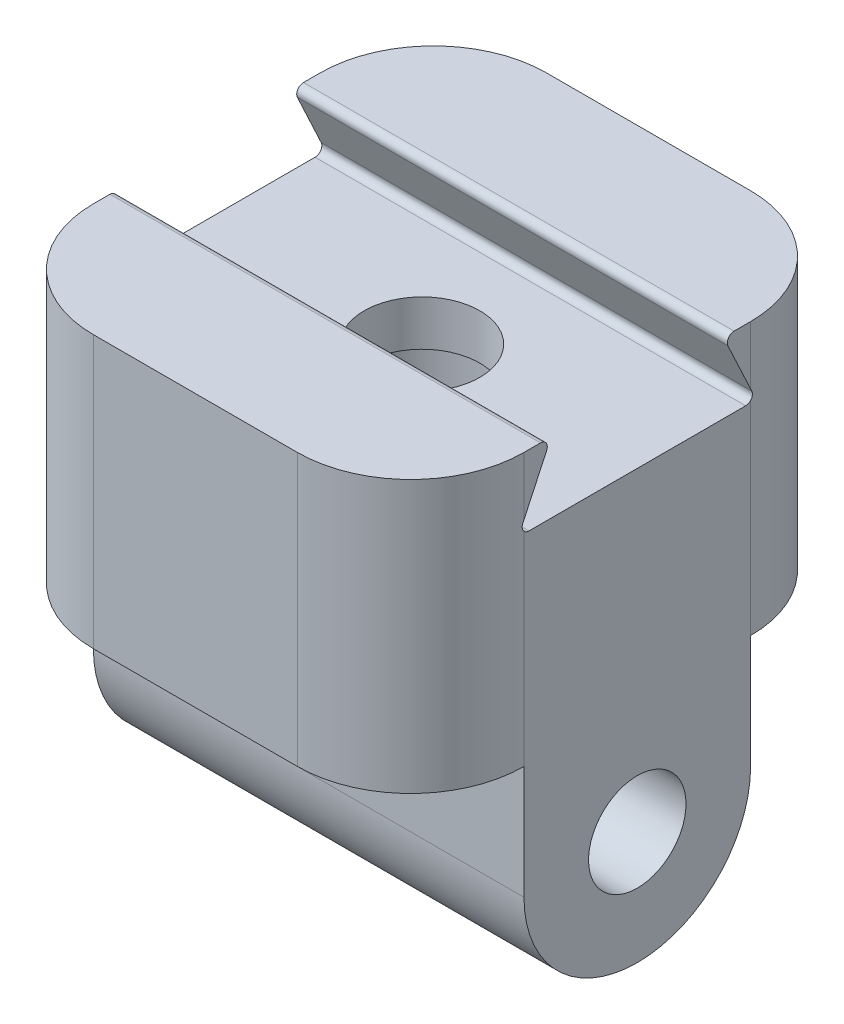
ISO-10303-21;
HEADER;
FILE_DESCRIPTION(('STEP AP214'),'2;1');
FILE_NAME('part.step','',(''),(''),'','','');
FILE_SCHEMA(('AUTOMOTIVE_DESIGN { 1 0 10303 214 1 1 1 1 }'));
ENDSEC;
DATA;
#1=APPLICATION_CONTEXT('core data for automotive mechanical design processes');
#2=APPLICATION_PROTOCOL_DEFINITION('international standard','automotive_design',2000,#1);
#3=PRODUCT_CONTEXT('',#1,'mechanical');
#4=PRODUCT('Part','Part','',(#3));
#5=PRODUCT_RELATED_PRODUCT_CATEGORY('part','',(#4));
#6=PRODUCT_DEFINITION_FORMATION('','',#4);
#7=PRODUCT_DEFINITION_CONTEXT('part definition',#1,'design');
#8=PRODUCT_DEFINITION('design','',#6,#7);
#9=PRODUCT_DEFINITION_SHAPE('','',#8);
#10=(LENGTH_UNIT() NAMED_UNIT(*) SI_UNIT(.MILLI.,.METRE.));
#11=(NAMED_UNIT(*) PLANE_ANGLE_UNIT() SI_UNIT($,.RADIAN.));
#12=(NAMED_UNIT(*) SI_UNIT($,.STERADIAN.) SOLID_ANGLE_UNIT());
#13=UNCERTAINTY_MEASURE_WITH_UNIT(LENGTH_MEASURE(1.E-05),#10,'distance_accuracy_value','');
#14=(GEOMETRIC_REPRESENTATION_CONTEXT(3) GLOBAL_UNCERTAINTY_ASSIGNED_CONTEXT((#13)) GLOBAL_UNIT_ASSIGNED_CONTEXT((#10,
#11,#12)) REPRESENTATION_CONTEXT('',''));
#15=CARTESIAN_POINT('',(0.,0.,0.));
#16=DIRECTION('',(0.,0.,1.));
#17=DIRECTION('',(1.,0.,0.));
#18=AXIS2_PLACEMENT_3D('',#15,#16,#17);
#19=CARTESIAN_POINT('',(0.,0.,0.));
#20=DIRECTION('',(0.,-1.,0.));
#21=DIRECTION('',(0.,0.,-1.));
#22=AXIS2_PLACEMENT_3D('',#19,#20,#21);
#23=PLANE('',#22);
#24=DIRECTION('',(-1.,0.,0.));
#25=VECTOR('',#24,1.);
#26=CARTESIAN_POINT('',(9.5,0.,5.));
#27=LINE('',#26,#25);
#28=CARTESIAN_POINT('',(9.5,0.,5.));
#29=VERTEX_POINT('',#28);
#30=CARTESIAN_POINT('',(-9.5,0.,5.));
#31=VERTEX_POINT('',#30);
#32=EDGE_CURVE('E225',#29,#31,#27,.T.);
#33=ORIENTED_EDGE('',*,*,#32,.F.);
#34=CARTESIAN_POINT('',(4.5,0.,5.));
#35=DIRECTION('',(0.,-1.,0.));
#36=DIRECTION('',(0.,0.,-1.));
#37=AXIS2_PLACEMENT_3D('',#34,#35,#36);
#38=CIRCLE('',#37,5.);
#39=CARTESIAN_POINT('',(4.5,0.,10.));
#40=VERTEX_POINT('',#39);
#41=EDGE_CURVE('E222',#29,#40,#38,.T.);
#42=ORIENTED_EDGE('',*,*,#41,.T.);
#43=DIRECTION('',(1.,0.,0.));
#44=VECTOR('',#43,1.);
#45=CARTESIAN_POINT('',(9.5,0.,10.));
#46=LINE('',#45,#44);
#47=CARTESIAN_POINT('',(-4.5,0.,10.));
#48=VERTEX_POINT('',#47);
#49=EDGE_CURVE('E261',#48,#40,#46,.T.);
#50=ORIENTED_EDGE('',*,*,#49,.F.);
#51=CARTESIAN_POINT('',(-4.5,0.,5.));
#52=DIRECTION('',(0.,-1.,0.));
#53=DIRECTION('',(0.,0.,-1.));
#54=AXIS2_PLACEMENT_3D('',#51,#52,#53);
#55=CIRCLE('',#54,5.);
#56=EDGE_CURVE('E292',#48,#31,#55,.T.);
#57=ORIENTED_EDGE('',*,*,#56,.T.);
#58=EDGE_LOOP('',(#33,#42,#50,#57));
#59=FACE_BOUND('',#58,.T.);
#60=ADVANCED_FACE('F36',(#59),#23,.T.);
#61=CARTESIAN_POINT('',(9.5,12.,-10.));
#62=DIRECTION('',(-1.,0.,0.));
#63=DIRECTION('',(0.,0.,1.));
#64=AXIS2_PLACEMENT_3D('',#61,#62,#63);
#65=PLANE('',#64);
#66=CARTESIAN_POINT('',(9.5,-5.,0.));
#67=DIRECTION('',(1.,0.,0.));
#68=DIRECTION('',(0.,0.,-1.));
#69=AXIS2_PLACEMENT_3D('',#66,#67,#68);
#70=CIRCLE('',#69,2.15);
#71=CARTESIAN_POINT('',(9.5,-5.,-2.15));
#72=VERTEX_POINT('',#71);
#73=EDGE_CURVE('E232',#72,#72,#70,.T.);
#74=ORIENTED_EDGE('',*,*,#73,.F.);
#75=EDGE_LOOP('',(#74));
#76=FACE_BOUND('',#75,.T.);
#77=CARTESIAN_POINT('',(9.5,-5.,0.));
#78=DIRECTION('',(-1.,0.,0.));
#79=DIRECTION('',(0.,0.,1.));
#80=AXIS2_PLACEMENT_3D('',#77,#78,#79);
#81=CIRCLE('',#80,5.);
#82=CARTESIAN_POINT('',(9.5,-5.,5.));
#83=VERTEX_POINT('',#82);
#84=CARTESIAN_POINT('',(9.5,-10.,0.));
#85=VERTEX_POINT('',#84);
#86=EDGE_CURVE('E530',#83,#85,#81,.F.);
#87=ORIENTED_EDGE('',*,*,#86,.T.);
#88=CARTESIAN_POINT('',(9.5,-5.,0.));
#89=DIRECTION('',(-1.,0.,0.));
#90=DIRECTION('',(0.,0.,1.));
#91=AXIS2_PLACEMENT_3D('',#88,#89,#90);
#92=CIRCLE('',#91,5.);
#93=CARTESIAN_POINT('',(9.5,-5.,-5.));
#94=VERTEX_POINT('',#93);
#95=EDGE_CURVE('E193',#85,#94,#92,.F.);
#96=ORIENTED_EDGE('',*,*,#95,.T.);
#97=DIRECTION('',(0.,1.,0.));
#98=VECTOR('',#97,1.);
#99=CARTESIAN_POINT('',(9.5,-10.,-5.));
#100=LINE('',#99,#98);
#101=CARTESIAN_POINT('',(9.5,0.,-5.));
#102=VERTEX_POINT('',#101);
#103=EDGE_CURVE('E187',#94,#102,#100,.T.);
#104=ORIENTED_EDGE('',*,*,#103,.T.);
#105=DIRECTION('',(0.,-1.,0.));
#106=VECTOR('',#105,1.);
#107=CARTESIAN_POINT('',(9.5,12.,-5.));
#108=LINE('',#107,#106);
#109=CARTESIAN_POINT('',(9.5,8.98748545009601,-5.));
#110=VERTEX_POINT('',#109);
#111=EDGE_CURVE('E190',#102,#110,#108,.F.);
#112=ORIENTED_EDGE('',*,*,#111,.T.);
#113=CARTESIAN_POINT('',(9.5,9.19046496526112,-4.77909432686476));
#114=DIRECTION('',(-1.,0.,0.));
#115=DIRECTION('',(0.,0.,1.));
#116=AXIS2_PLACEMENT_3D('',#113,#114,#115);
#117=CIRCLE('',#116,0.3);
#118=CARTESIAN_POINT('',(9.5,8.89046496526112,-4.77909432686476));
#119=VERTEX_POINT('',#118);
#120=EDGE_CURVE('E370',#110,#119,#117,.T.);
#121=ORIENTED_EDGE('',*,*,#120,.T.);
#122=DIRECTION('',(0.,0.,-1.));
#123=VECTOR('',#122,1.);
#124=CARTESIAN_POINT('',(9.5,8.89046496526112,-5.25));
#125=LINE('',#124,#123);
#126=CARTESIAN_POINT('',(9.5,8.89046496526112,4.77909432686476));
#127=VERTEX_POINT('',#126);
#128=EDGE_CURVE('E256',#127,#119,#125,.T.);
#129=ORIENTED_EDGE('',*,*,#128,.F.);
#130=CARTESIAN_POINT('',(9.5,9.19046496526112,4.77909432686476));
#131=DIRECTION('',(-1.,0.,0.));
#132=DIRECTION('',(0.,0.,1.));
#133=AXIS2_PLACEMENT_3D('',#130,#131,#132);
#134=CIRCLE('',#133,0.3);
#135=CARTESIAN_POINT('',(9.5,8.987485450096,5.));
#136=VERTEX_POINT('',#135);
#137=EDGE_CURVE('E395',#127,#136,#134,.T.);
#138=ORIENTED_EDGE('',*,*,#137,.T.);
#139=DIRECTION('',(0.,-1.,0.));
#140=VECTOR('',#139,1.);
#141=CARTESIAN_POINT('',(9.5,12.,5.));
#142=LINE('',#141,#140);
#143=EDGE_CURVE('E328',#136,#29,#142,.T.);
#144=ORIENTED_EDGE('',*,*,#143,.T.);
#145=DIRECTION('',(0.,1.,0.));
#146=VECTOR('',#145,1.);
#147=CARTESIAN_POINT('',(9.5,-10.,5.));
#148=LINE('',#147,#146);
#149=EDGE_CURVE('E199',#83,#29,#148,.T.);
#150=ORIENTED_EDGE('',*,*,#149,.F.);
#151=EDGE_LOOP('',(#87,#96,#104,#112,#121,#129,#138,#144,#150));
#152=FACE_BOUND('',#151,.T.);
#153=ADVANCED_FACE('F189',(#76,#152),#65,.F.);
#154=DIRECTION('',(0.,-0.906307787036651,0.422618261740697));
#155=VECTOR('',#154,1.);
#156=CARTESIAN_POINT('',(9.5,12.,3.8));
#157=LINE('',#156,#155);
#158=CARTESIAN_POINT('',(9.5,11.5732145214778,3.99901333702425));
#159=VERTEX_POINT('',#158);
#160=CARTESIAN_POINT('',(9.5,9.42659169538852,5.));
#161=VERTEX_POINT('',#160);
#162=EDGE_CURVE('E264',#159,#161,#157,.T.);
#163=ORIENTED_EDGE('',*,*,#162,.F.);
#164=CARTESIAN_POINT('',(9.5,11.7,4.27090567313525));
#165=DIRECTION('',(-1.,0.,0.));
#166=DIRECTION('',(0.,0.,1.));
#167=AXIS2_PLACEMENT_3D('',#164,#165,#166);
#168=CIRCLE('',#167,0.3);
#169=CARTESIAN_POINT('',(9.5,12.,4.27090567313525));
#170=VERTEX_POINT('',#169);
#171=EDGE_CURVE('E350',#159,#170,#168,.F.);
#172=ORIENTED_EDGE('',*,*,#171,.T.);
#173=DIRECTION('',(0.,0.,-1.));
#174=VECTOR('',#173,1.);
#175=CARTESIAN_POINT('',(9.5,12.,-10.));
#176=LINE('',#175,#174);
#177=CARTESIAN_POINT('',(9.5,12.,5.));
#178=VERTEX_POINT('',#177);
#179=EDGE_CURVE('E276',#178,#170,#176,.T.);
#180=ORIENTED_EDGE('',*,*,#179,.F.);
#181=DIRECTION('',(0.,-1.,0.));
#182=VECTOR('',#181,1.);
#183=CARTESIAN_POINT('',(9.5,12.,5.));
#184=LINE('',#183,#182);
#185=EDGE_CURVE('E331',#178,#161,#184,.T.);
#186=ORIENTED_EDGE('',*,*,#185,.T.);
#187=EDGE_LOOP('',(#163,#172,#180,#186));
#188=FACE_BOUND('',#187,.T.);
#189=ADVANCED_FACE('F430',(#188),#65,.F.);
#190=CARTESIAN_POINT('',(-9.5,12.,-10.));
#191=DIRECTION('',(1.,0.,0.));
#192=DIRECTION('',(0.,0.,-1.));
#193=AXIS2_PLACEMENT_3D('',#190,#191,#192);
#194=PLANE('',#193);
#195=CARTESIAN_POINT('',(-9.5,-5.,0.));
#196=DIRECTION('',(1.,0.,0.));
#197=DIRECTION('',(0.,0.,-1.));
#198=AXIS2_PLACEMENT_3D('',#195,#196,#197);
#199=CIRCLE('',#198,2.15);
#200=CARTESIAN_POINT('',(-9.5,-5.,-2.15));
#201=VERTEX_POINT('',#200);
#202=EDGE_CURVE('E226',#201,#201,#199,.T.);
#203=ORIENTED_EDGE('',*,*,#202,.T.);
#204=EDGE_LOOP('',(#203));
#205=FACE_BOUND('',#204,.T.);
#206=DIRECTION('',(0.,1.,0.));
#207=VECTOR('',#206,1.);
#208=CARTESIAN_POINT('',(-9.5,-10.,-5.));
#209=LINE('',#208,#207);
#210=CARTESIAN_POINT('',(-9.5,-5.,-5.));
#211=VERTEX_POINT('',#210);
#212=CARTESIAN_POINT('',(-9.5,0.,-5.));
#213=VERTEX_POINT('',#212);
#214=EDGE_CURVE('E198',#211,#213,#209,.T.);
#215=ORIENTED_EDGE('',*,*,#214,.F.);
#216=CARTESIAN_POINT('',(-9.5,-5.,0.));
#217=DIRECTION('',(1.,0.,0.));
#218=DIRECTION('',(0.,0.,-1.));
#219=AXIS2_PLACEMENT_3D('',#216,#217,#218);
#220=CIRCLE('',#219,5.);
#221=CARTESIAN_POINT('',(-9.5,-10.,0.));
#222=VERTEX_POINT('',#221);
#223=EDGE_CURVE('E45',#211,#222,#220,.F.);
#224=ORIENTED_EDGE('',*,*,#223,.T.);
#225=CARTESIAN_POINT('',(-9.5,-5.,0.));
#226=DIRECTION('',(1.,0.,0.));
#227=DIRECTION('',(0.,0.,-1.));
#228=AXIS2_PLACEMENT_3D('',#225,#226,#227);
#229=CIRCLE('',#228,5.);
#230=CARTESIAN_POINT('',(-9.5,-5.,5.));
#231=VERTEX_POINT('',#230);
#232=EDGE_CURVE('E52',#222,#231,#229,.F.);
#233=ORIENTED_EDGE('',*,*,#232,.T.);
#234=DIRECTION('',(0.,1.,0.));
#235=VECTOR('',#234,1.);
#236=CARTESIAN_POINT('',(-9.5,-10.,5.));
#237=LINE('',#236,#235);
#238=EDGE_CURVE('E229',#231,#31,#237,.T.);
#239=ORIENTED_EDGE('',*,*,#238,.T.);
#240=DIRECTION('',(0.,-1.,0.));
#241=VECTOR('',#240,1.);
#242=CARTESIAN_POINT('',(-9.5,12.,5.));
#243=LINE('',#242,#241);
#244=CARTESIAN_POINT('',(-9.5,8.987485450096,5.));
#245=VERTEX_POINT('',#244);
#246=EDGE_CURVE('E303',#31,#245,#243,.F.);
#247=ORIENTED_EDGE('',*,*,#246,.T.);
#248=CARTESIAN_POINT('',(-9.5,9.19046496526112,4.77909432686476));
#249=DIRECTION('',(1.,0.,0.));
#250=DIRECTION('',(0.,0.,-1.));
#251=AXIS2_PLACEMENT_3D('',#248,#249,#250);
#252=CIRCLE('',#251,0.3);
#253=CARTESIAN_POINT('',(-9.5,8.89046496526112,4.77909432686476));
#254=VERTEX_POINT('',#253);
#255=EDGE_CURVE('E533',#245,#254,#252,.T.);
#256=ORIENTED_EDGE('',*,*,#255,.T.);
#257=DIRECTION('',(0.,0.,-1.));
#258=VECTOR('',#257,1.);
#259=CARTESIAN_POINT('',(-9.5,8.89046496526112,-5.25));
#260=LINE('',#259,#258);
#261=CARTESIAN_POINT('',(-9.5,8.89046496526112,-4.77909432686475));
#262=VERTEX_POINT('',#261);
#263=EDGE_CURVE('E258',#254,#262,#260,.T.);
#264=ORIENTED_EDGE('',*,*,#263,.T.);
#265=CARTESIAN_POINT('',(-9.5,9.19046496526112,-4.77909432686475));
#266=DIRECTION('',(1.,0.,0.));
#267=DIRECTION('',(0.,0.,-1.));
#268=AXIS2_PLACEMENT_3D('',#265,#266,#267);
#269=CIRCLE('',#268,0.3);
#270=CARTESIAN_POINT('',(-9.5,8.98748545009601,-5.));
#271=VERTEX_POINT('',#270);
#272=EDGE_CURVE('E490',#262,#271,#269,.T.);
#273=ORIENTED_EDGE('',*,*,#272,.T.);
#274=DIRECTION('',(0.,-1.,0.));
#275=VECTOR('',#274,1.);
#276=CARTESIAN_POINT('',(-9.5,12.,-5.));
#277=LINE('',#276,#275);
#278=EDGE_CURVE('E295',#271,#213,#277,.T.);
#279=ORIENTED_EDGE('',*,*,#278,.T.);
#280=EDGE_LOOP('',(#215,#224,#233,#239,#247,#256,#264,#273,#279));
#281=FACE_BOUND('',#280,.T.);
#282=ADVANCED_FACE('F465',(#205,#281),#194,.F.);
#283=DIRECTION('',(0.,0.906307787036651,0.422618261740697));
#284=VECTOR('',#283,1.);
#285=CARTESIAN_POINT('',(-9.5,12.,-3.8));
#286=LINE('',#285,#284);
#287=CARTESIAN_POINT('',(-9.5,9.42659169538851,-5.));
#288=VERTEX_POINT('',#287);
#289=CARTESIAN_POINT('',(-9.5,11.5732145214778,-3.99901333702425));
#290=VERTEX_POINT('',#289);
#291=EDGE_CURVE('E252',#288,#290,#286,.T.);
#292=ORIENTED_EDGE('',*,*,#291,.T.);
#293=CARTESIAN_POINT('',(-9.5,11.7,-4.27090567313524));
#294=DIRECTION('',(1.,0.,0.));
#295=DIRECTION('',(0.,0.,-1.));
#296=AXIS2_PLACEMENT_3D('',#293,#294,#295);
#297=CIRCLE('',#296,0.3);
#298=CARTESIAN_POINT('',(-9.5,12.,-4.27090567313524));
#299=VERTEX_POINT('',#298);
#300=EDGE_CURVE('E361',#290,#299,#297,.F.);
#301=ORIENTED_EDGE('',*,*,#300,.T.);
#302=DIRECTION('',(0.,0.,1.));
#303=VECTOR('',#302,1.);
#304=CARTESIAN_POINT('',(-9.5,12.,-10.));
#305=LINE('',#304,#303);
#306=CARTESIAN_POINT('',(-9.5,12.,-5.));
#307=VERTEX_POINT('',#306);
#308=EDGE_CURVE('E268',#307,#299,#305,.T.);
#309=ORIENTED_EDGE('',*,*,#308,.F.);
#310=DIRECTION('',(0.,-1.,0.));
#311=VECTOR('',#310,1.);
#312=CARTESIAN_POINT('',(-9.5,12.,-5.));
#313=LINE('',#312,#311);
#314=EDGE_CURVE('E297',#307,#288,#313,.T.);
#315=ORIENTED_EDGE('',*,*,#314,.T.);
#316=EDGE_LOOP('',(#292,#301,#309,#315));
#317=FACE_BOUND('',#316,.T.);
#318=ADVANCED_FACE('F456',(#317),#194,.F.);
#319=CARTESIAN_POINT('',(0.,12.,0.));
#320=DIRECTION('',(0.,-1.,0.));
#321=DIRECTION('',(0.,0.,-1.));
#322=AXIS2_PLACEMENT_3D('',#319,#320,#321);
#323=PLANE('',#322);
#324=ORIENTED_EDGE('',*,*,#308,.T.);
#325=DIRECTION('',(1.,0.,0.));
#326=VECTOR('',#325,1.);
#327=CARTESIAN_POINT('',(0.,12.,-4.27090567313525));
#328=LINE('',#327,#326);
#329=CARTESIAN_POINT('',(9.5,12.,-4.27090567313525));
#330=VERTEX_POINT('',#329);
#331=EDGE_CURVE('E356',#299,#330,#328,.T.);
#332=ORIENTED_EDGE('',*,*,#331,.T.);
#333=CARTESIAN_POINT('',(9.5,12.,-5.));
#334=VERTEX_POINT('',#333);
#335=EDGE_CURVE('E275',#330,#334,#176,.T.);
#336=ORIENTED_EDGE('',*,*,#335,.T.);
#337=CARTESIAN_POINT('',(4.5,12.,-5.));
#338=DIRECTION('',(0.,-1.,0.));
#339=DIRECTION('',(0.,0.,-1.));
#340=AXIS2_PLACEMENT_3D('',#337,#338,#339);
#341=CIRCLE('',#340,5.);
#342=CARTESIAN_POINT('',(4.5,12.,-10.));
#343=VERTEX_POINT('',#342);
#344=EDGE_CURVE('E324',#334,#343,#341,.F.);
#345=ORIENTED_EDGE('',*,*,#344,.T.);
#346=DIRECTION('',(-1.,0.,0.));
#347=VECTOR('',#346,1.);
#348=CARTESIAN_POINT('',(9.5,12.,-10.));
#349=LINE('',#348,#347);
#350=CARTESIAN_POINT('',(-4.5,12.,-10.));
#351=VERTEX_POINT('',#350);
#352=EDGE_CURVE('E279',#343,#351,#349,.T.);
#353=ORIENTED_EDGE('',*,*,#352,.T.);
#354=CARTESIAN_POINT('',(-4.5,12.,-5.));
#355=DIRECTION('',(0.,-1.,0.));
#356=DIRECTION('',(0.,0.,-1.));
#357=AXIS2_PLACEMENT_3D('',#354,#355,#356);
#358=CIRCLE('',#357,5.);
#359=EDGE_CURVE('E326',#351,#307,#358,.F.);
#360=ORIENTED_EDGE('',*,*,#359,.T.);
#361=EDGE_LOOP('',(#324,#332,#336,#345,#353,#360));
#362=FACE_BOUND('',#361,.T.);
#363=ADVANCED_FACE('F449',(#362),#323,.F.);
#364=CARTESIAN_POINT('',(-9.5,12.,4.27090567313525));
#365=VERTEX_POINT('',#364);
#366=CARTESIAN_POINT('',(-9.5,12.,5.));
#367=VERTEX_POINT('',#366);
#368=EDGE_CURVE('E272',#365,#367,#305,.T.);
#369=ORIENTED_EDGE('',*,*,#368,.F.);
#370=CARTESIAN_POINT('',(-9.5,11.7,4.27090567313525));
#371=DIRECTION('',(1.,0.,0.));
#372=DIRECTION('',(0.,0.,-1.));
#373=AXIS2_PLACEMENT_3D('',#370,#371,#372);
#374=CIRCLE('',#373,0.3);
#375=CARTESIAN_POINT('',(-9.5,11.5732145214778,3.99901333702425));
#376=VERTEX_POINT('',#375);
#377=EDGE_CURVE('E354',#365,#376,#374,.F.);
#378=ORIENTED_EDGE('',*,*,#377,.T.);
#379=DIRECTION('',(0.,-0.906307787036651,0.422618261740697));
#380=VECTOR('',#379,1.);
#381=CARTESIAN_POINT('',(-9.5,12.,3.8));
#382=LINE('',#381,#380);
#383=CARTESIAN_POINT('',(-9.5,9.42659169538852,5.));
#384=VERTEX_POINT('',#383);
#385=EDGE_CURVE('E255',#376,#384,#382,.T.);
#386=ORIENTED_EDGE('',*,*,#385,.T.);
#387=DIRECTION('',(0.,-1.,0.));
#388=VECTOR('',#387,1.);
#389=CARTESIAN_POINT('',(-9.5,12.,5.));
#390=LINE('',#389,#388);
#391=EDGE_CURVE('E300',#384,#367,#390,.F.);
#392=ORIENTED_EDGE('',*,*,#391,.T.);
#393=EDGE_LOOP('',(#369,#378,#386,#392));
#394=FACE_BOUND('',#393,.T.);
#395=ADVANCED_FACE('F455',(#394),#194,.F.);
#396=CARTESIAN_POINT('',(9.5,12.,10.));
#397=DIRECTION('',(0.,0.,-1.));
#398=DIRECTION('',(-1.,0.,0.));
#399=AXIS2_PLACEMENT_3D('',#396,#397,#398);
#400=PLANE('',#399);
#401=DIRECTION('',(1.,0.,0.));
#402=VECTOR('',#401,1.);
#403=CARTESIAN_POINT('',(9.5,12.,10.));
#404=LINE('',#403,#402);
#405=CARTESIAN_POINT('',(-4.5,12.,10.));
#406=VERTEX_POINT('',#405);
#407=CARTESIAN_POINT('',(4.5,12.,10.));
#408=VERTEX_POINT('',#407);
#409=EDGE_CURVE('E271',#406,#408,#404,.T.);
#410=ORIENTED_EDGE('',*,*,#409,.F.);
#411=DIRECTION('',(0.,-1.,0.));
#412=VECTOR('',#411,1.);
#413=CARTESIAN_POINT('',(-4.5,12.,10.));
#414=LINE('',#413,#412);
#415=EDGE_CURVE('E287',#406,#48,#414,.T.);
#416=ORIENTED_EDGE('',*,*,#415,.T.);
#417=ORIENTED_EDGE('',*,*,#49,.T.);
#418=DIRECTION('',(0.,-1.,0.));
#419=VECTOR('',#418,1.);
#420=CARTESIAN_POINT('',(4.5,12.,10.));
#421=LINE('',#420,#419);
#422=EDGE_CURVE('E282',#40,#408,#421,.F.);
#423=ORIENTED_EDGE('',*,*,#422,.T.);
#424=EDGE_LOOP('',(#410,#416,#417,#423));
#425=FACE_BOUND('',#424,.T.);
#426=ADVANCED_FACE('F462',(#425),#400,.F.);
#427=ORIENTED_EDGE('',*,*,#335,.F.);
#428=CARTESIAN_POINT('',(9.5,11.7,-4.27090567313525));
#429=DIRECTION('',(-1.,0.,0.));
#430=DIRECTION('',(0.,0.,1.));
#431=AXIS2_PLACEMENT_3D('',#428,#429,#430);
#432=CIRCLE('',#431,0.3);
#433=CARTESIAN_POINT('',(9.5,11.5732145214778,-3.99901333702425));
#434=VERTEX_POINT('',#433);
#435=EDGE_CURVE('E359',#330,#434,#432,.F.);
#436=ORIENTED_EDGE('',*,*,#435,.T.);
#437=DIRECTION('',(0.,0.906307787036651,0.422618261740697));
#438=VECTOR('',#437,1.);
#439=CARTESIAN_POINT('',(9.5,12.,-3.8));
#440=LINE('',#439,#438);
#441=CARTESIAN_POINT('',(9.5,9.42659169538851,-5.));
#442=VERTEX_POINT('',#441);
#443=EDGE_CURVE('E251',#442,#434,#440,.T.);
#444=ORIENTED_EDGE('',*,*,#443,.F.);
#445=DIRECTION('',(0.,-1.,0.));
#446=VECTOR('',#445,1.);
#447=CARTESIAN_POINT('',(9.5,12.,-5.));
#448=LINE('',#447,#446);
#449=EDGE_CURVE('E211',#442,#334,#448,.F.);
#450=ORIENTED_EDGE('',*,*,#449,.T.);
#451=EDGE_LOOP('',(#427,#436,#444,#450));
#452=FACE_BOUND('',#451,.T.);
#453=ADVANCED_FACE('F433',(#452),#65,.F.);
#454=CARTESIAN_POINT('',(9.5,12.,-10.));
#455=DIRECTION('',(0.,0.,1.));
#456=DIRECTION('',(1.,0.,0.));
#457=AXIS2_PLACEMENT_3D('',#454,#455,#456);
#458=PLANE('',#457);
#459=DIRECTION('',(-1.,0.,0.));
#460=VECTOR('',#459,1.);
#461=CARTESIAN_POINT('',(9.5,0.,-10.));
#462=LINE('',#461,#460);
#463=CARTESIAN_POINT('',(4.5,0.,-10.));
#464=VERTEX_POINT('',#463);
#465=CARTESIAN_POINT('',(-4.5,0.,-10.));
#466=VERTEX_POINT('',#465);
#467=EDGE_CURVE('E220',#464,#466,#462,.T.);
#468=ORIENTED_EDGE('',*,*,#467,.T.);
#469=DIRECTION('',(0.,-1.,0.));
#470=VECTOR('',#469,1.);
#471=CARTESIAN_POINT('',(-4.5,12.,-10.));
#472=LINE('',#471,#470);
#473=EDGE_CURVE('E322',#466,#351,#472,.F.);
#474=ORIENTED_EDGE('',*,*,#473,.T.);
#475=ORIENTED_EDGE('',*,*,#352,.F.);
#476=DIRECTION('',(0.,-1.,0.));
#477=VECTOR('',#476,1.);
#478=CARTESIAN_POINT('',(4.5,12.,-10.));
#479=LINE('',#478,#477);
#480=EDGE_CURVE('E320',#343,#464,#479,.T.);
#481=ORIENTED_EDGE('',*,*,#480,.T.);
#482=EDGE_LOOP('',(#468,#474,#475,#481));
#483=FACE_BOUND('',#482,.T.);
#484=ADVANCED_FACE('F447',(#483),#458,.F.);
#485=ORIENTED_EDGE('',*,*,#179,.T.);
#486=DIRECTION('',(1.,0.,0.));
#487=VECTOR('',#486,1.);
#488=CARTESIAN_POINT('',(0.,12.,4.27090567313525));
#489=LINE('',#488,#487);
#490=EDGE_CURVE('E352',#170,#365,#489,.F.);
#491=ORIENTED_EDGE('',*,*,#490,.T.);
#492=ORIENTED_EDGE('',*,*,#368,.T.);
#493=CARTESIAN_POINT('',(-4.5,12.,5.));
#494=DIRECTION('',(0.,-1.,0.));
#495=DIRECTION('',(0.,0.,-1.));
#496=AXIS2_PLACEMENT_3D('',#493,#494,#495);
#497=CIRCLE('',#496,5.);
#498=EDGE_CURVE('E313',#367,#406,#497,.F.);
#499=ORIENTED_EDGE('',*,*,#498,.T.);
#500=ORIENTED_EDGE('',*,*,#409,.T.);
#501=CARTESIAN_POINT('',(4.5,12.,5.));
#502=DIRECTION('',(0.,-1.,0.));
#503=DIRECTION('',(0.,0.,-1.));
#504=AXIS2_PLACEMENT_3D('',#501,#502,#503);
#505=CIRCLE('',#504,5.);
#506=EDGE_CURVE('E311',#408,#178,#505,.F.);
#507=ORIENTED_EDGE('',*,*,#506,.T.);
#508=EDGE_LOOP('',(#485,#491,#492,#499,#500,#507));
#509=FACE_BOUND('',#508,.T.);
#510=ADVANCED_FACE('F439',(#509),#323,.F.);
#511=DIRECTION('',(1.,0.,0.));
#512=VECTOR('',#511,1.);
#513=CARTESIAN_POINT('',(9.5,0.,-5.));
#514=LINE('',#513,#512);
#515=EDGE_CURVE('E217',#213,#102,#514,.T.);
#516=ORIENTED_EDGE('',*,*,#515,.F.);
#517=CARTESIAN_POINT('',(-4.5,0.,-5.));
#518=DIRECTION('',(0.,-1.,0.));
#519=DIRECTION('',(0.,0.,-1.));
#520=AXIS2_PLACEMENT_3D('',#517,#518,#519);
#521=CIRCLE('',#520,5.);
#522=EDGE_CURVE('E221',#213,#466,#521,.T.);
#523=ORIENTED_EDGE('',*,*,#522,.T.);
#524=ORIENTED_EDGE('',*,*,#467,.F.);
#525=CARTESIAN_POINT('',(4.5,0.,-5.));
#526=DIRECTION('',(0.,-1.,0.));
#527=DIRECTION('',(0.,0.,-1.));
#528=AXIS2_PLACEMENT_3D('',#525,#526,#527);
#529=CIRCLE('',#528,5.);
#530=EDGE_CURVE('E206',#464,#102,#529,.T.);
#531=ORIENTED_EDGE('',*,*,#530,.T.);
#532=EDGE_LOOP('',(#516,#523,#524,#531));
#533=FACE_BOUND('',#532,.T.);
#534=ADVANCED_FACE('F216',(#533),#23,.T.);
#535=CARTESIAN_POINT('',(-9.5,12.,-3.8));
#536=DIRECTION('',(0.,0.422618261740697,-0.906307787036651));
#537=DIRECTION('',(0.,0.906307787036651,0.422618261740697));
#538=AXIS2_PLACEMENT_3D('',#535,#536,#537);
#539=PLANE('',#538);
#540=CARTESIAN_POINT('',(-4.5,9.42659169538851,-5.));
#541=DIRECTION('',(0.,0.422618261740697,-0.906307787036651));
#542=DIRECTION('',(0.,-0.906307787036651,-0.422618261740697));
#543=AXIS2_PLACEMENT_3D('',#540,#541,#542);
#544=ELLIPSE('',#543,11.8310079157626,5.);
#545=CARTESIAN_POINT('',(-9.49974002926138,9.31725044378333,-5.05098666297575));
#546=VERTEX_POINT('',#545);
#547=EDGE_CURVE('E317',#288,#546,#544,.F.);
#548=ORIENTED_EDGE('',*,*,#547,.T.);
#549=DIRECTION('',(1.,0.,0.));
#550=VECTOR('',#549,1.);
#551=CARTESIAN_POINT('',(9.49374608885954,9.31725044378333,-5.05098666297575));
#552=LINE('',#551,#550);
#553=CARTESIAN_POINT('',(9.49974002926138,9.31725044378332,-5.05098666297575));
#554=VERTEX_POINT('',#553);
#555=EDGE_CURVE('E337',#546,#554,#552,.T.);
#556=ORIENTED_EDGE('',*,*,#555,.T.);
#557=CARTESIAN_POINT('',(4.5,9.42659169538851,-5.));
#558=DIRECTION('',(0.,0.422618261740697,-0.906307787036651));
#559=DIRECTION('',(0.,-0.906307787036651,-0.422618261740697));
#560=AXIS2_PLACEMENT_3D('',#557,#558,#559);
#561=ELLIPSE('',#560,11.8310079157626,5.);
#562=EDGE_CURVE('E315',#554,#442,#561,.F.);
#563=ORIENTED_EDGE('',*,*,#562,.T.);
#564=ORIENTED_EDGE('',*,*,#443,.T.);
#565=DIRECTION('',(1.,0.,0.));
#566=VECTOR('',#565,1.);
#567=CARTESIAN_POINT('',(-9.5,11.5732145214778,-3.99901333702425));
#568=LINE('',#567,#566);
#569=EDGE_CURVE('E210',#434,#290,#568,.F.);
#570=ORIENTED_EDGE('',*,*,#569,.T.);
#571=ORIENTED_EDGE('',*,*,#291,.F.);
#572=EDGE_LOOP('',(#548,#556,#563,#564,#570,#571));
#573=FACE_BOUND('',#572,.T.);
#574=ADVANCED_FACE('F438',(#573),#539,.F.);
#575=CARTESIAN_POINT('',(-9.5,8.89046496526112,-5.25));
#576=DIRECTION('',(0.,-1.,0.));
#577=DIRECTION('',(0.,0.,-1.));
#578=AXIS2_PLACEMENT_3D('',#575,#576,#577);
#579=PLANE('',#578);
#580=CARTESIAN_POINT('',(0.,8.89046496526112,0.));
#581=DIRECTION('',(0.,1.,0.));
#582=DIRECTION('',(0.,0.,1.));
#583=AXIS2_PLACEMENT_3D('',#580,#581,#582);
#584=CIRCLE('',#583,2.55);
#585=CARTESIAN_POINT('',(0.,8.89046496526112,2.55));
#586=VERTEX_POINT('',#585);
#587=EDGE_CURVE('E248',#586,#586,#584,.T.);
#588=ORIENTED_EDGE('',*,*,#587,.F.);
#589=EDGE_LOOP('',(#588));
#590=FACE_BOUND('',#589,.T.);
#591=ORIENTED_EDGE('',*,*,#128,.T.);
#592=DIRECTION('',(1.,0.,0.));
#593=VECTOR('',#592,1.);
#594=CARTESIAN_POINT('',(-9.49374608885954,8.89046496526112,-4.77909432686475));
#595=LINE('',#594,#593);
#596=EDGE_CURVE('E343',#119,#262,#595,.F.);
#597=ORIENTED_EDGE('',*,*,#596,.T.);
#598=ORIENTED_EDGE('',*,*,#263,.F.);
#599=DIRECTION('',(1.,0.,0.));
#600=VECTOR('',#599,1.);
#601=CARTESIAN_POINT('',(9.49374608885954,8.89046496526112,4.77909432686476));
#602=LINE('',#601,#600);
#603=EDGE_CURVE('E340',#254,#127,#602,.T.);
#604=ORIENTED_EDGE('',*,*,#603,.T.);
#605=EDGE_LOOP('',(#591,#597,#598,#604));
#606=FACE_BOUND('',#605,.T.);
#607=ADVANCED_FACE('F444',(#590,#606),#579,.F.);
#608=CARTESIAN_POINT('',(-9.5,12.,3.8));
#609=DIRECTION('',(0.,0.422618261740697,0.906307787036651));
#610=DIRECTION('',(0.,-0.906307787036651,0.422618261740697));
#611=AXIS2_PLACEMENT_3D('',#608,#609,#610);
#612=PLANE('',#611);
#613=CARTESIAN_POINT('',(4.5,9.42659169538851,5.));
#614=DIRECTION('',(0.,0.422618261740697,0.906307787036651));
#615=DIRECTION('',(0.,-0.906307787036651,0.422618261740697));
#616=AXIS2_PLACEMENT_3D('',#613,#614,#615);
#617=ELLIPSE('',#616,11.8310079157626,5.);
#618=CARTESIAN_POINT('',(9.49974002926138,9.31725044378332,5.05098666297575));
#619=VERTEX_POINT('',#618);
#620=EDGE_CURVE('E305',#161,#619,#617,.F.);
#621=ORIENTED_EDGE('',*,*,#620,.T.);
#622=DIRECTION('',(1.,0.,0.));
#623=VECTOR('',#622,1.);
#624=CARTESIAN_POINT('',(-9.49374608885954,9.31725044378332,5.05098666297575));
#625=LINE('',#624,#623);
#626=CARTESIAN_POINT('',(-9.49974002926138,9.31725044378333,5.05098666297575));
#627=VERTEX_POINT('',#626);
#628=EDGE_CURVE('E348',#619,#627,#625,.F.);
#629=ORIENTED_EDGE('',*,*,#628,.T.);
#630=CARTESIAN_POINT('',(-4.5,9.42659169538852,5.));
#631=DIRECTION('',(0.,0.422618261740697,0.906307787036651));
#632=DIRECTION('',(0.,-0.906307787036651,0.422618261740697));
#633=AXIS2_PLACEMENT_3D('',#630,#631,#632);
#634=ELLIPSE('',#633,11.8310079157626,5.);
#635=EDGE_CURVE('E308',#627,#384,#634,.F.);
#636=ORIENTED_EDGE('',*,*,#635,.T.);
#637=ORIENTED_EDGE('',*,*,#385,.F.);
#638=DIRECTION('',(1.,0.,0.));
#639=VECTOR('',#638,1.);
#640=CARTESIAN_POINT('',(-9.5,11.5732145214778,3.99901333702425));
#641=LINE('',#640,#639);
#642=EDGE_CURVE('E345',#376,#159,#641,.T.);
#643=ORIENTED_EDGE('',*,*,#642,.T.);
#644=ORIENTED_EDGE('',*,*,#162,.T.);
#645=EDGE_LOOP('',(#621,#629,#636,#637,#643,#644));
#646=FACE_BOUND('',#645,.T.);
#647=ADVANCED_FACE('F507',(#646),#612,.F.);
#648=CARTESIAN_POINT('',(-4.5,12.,5.));
#649=DIRECTION('',(0.,-1.,0.));
#650=DIRECTION('',(0.,0.,-1.));
#651=AXIS2_PLACEMENT_3D('',#648,#649,#650);
#652=CYLINDRICAL_SURFACE('',#651,5.);
#653=ORIENTED_EDGE('',*,*,#635,.F.);
#654=CARTESIAN_POINT('',(-9.49974002926138,9.31725044378332,5.05098666297575));
#655=CARTESIAN_POINT('',(-9.49966495059368,9.30196132007715,5.05813196041137));
#656=CARTESIAN_POINT('',(-9.49959228508533,9.28606238318854,5.06395958110792));
#657=CARTESIAN_POINT('',(-9.49947153046027,9.25352622698707,5.07287181841047));
#658=CARTESIAN_POINT('',(-9.49942342198788,9.2368896003928,5.07595859675175));
#659=CARTESIAN_POINT('',(-9.49937134043919,9.20332710766466,5.0792937709661));
#660=CARTESIAN_POINT('',(-9.49936738495113,9.18640112895669,5.07954103572629));
#661=CARTESIAN_POINT('',(-9.49940429128445,9.15274757656405,5.07719112455624));
#662=CARTESIAN_POINT('',(-9.49944515316663,9.13602000314852,5.07459394476791));
#663=CARTESIAN_POINT('',(-9.4995576121779,9.10323448577478,5.06662821522457));
#664=CARTESIAN_POINT('',(-9.49962921984104,9.08717677339332,5.06125871549668));
#665=CARTESIAN_POINT('',(-9.49977499167169,9.0561967653273,5.04789904947302));
#666=CARTESIAN_POINT('',(-9.49984915375818,9.04127357574877,5.03991097328556));
#667=CARTESIAN_POINT('',(-9.49993355483578,9.02010721933136,5.02617482689609));
#668=CARTESIAN_POINT('',(-9.49995718855123,9.013270683035,5.02131832415809));
#669=CARTESIAN_POINT('',(-9.49999039147167,9.00004050336599,5.01106064952604));
#670=CARTESIAN_POINT('',(-9.49999998796731,8.99364602369702,5.00566055637724));
#671=CARTESIAN_POINT('',(-9.50000000000004,8.98748545009598,5.00000000000003));
#672=B_SPLINE_CURVE_WITH_KNOTS('',3,(#654,#655,#656,#657,#658,#659,#660,#661,#662,#663,#664,
#665,#666,#667,#668,#669,#670,#671),.UNSPECIFIED.,.F.,.F.,(4,2,2,2,2,2,2,2,4),(0.,
0.0505625435590106,0.101085172318541,0.15162792593838,0.202170748112303,0.252730900972733,
0.303250795345461,0.328383296719272,0.353466871162501),.UNSPECIFIED.);
#673=EDGE_CURVE('E394',#627,#245,#672,.T.);
#674=ORIENTED_EDGE('',*,*,#673,.T.);
#675=ORIENTED_EDGE('',*,*,#246,.F.);
#676=ORIENTED_EDGE('',*,*,#56,.F.);
#677=ORIENTED_EDGE('',*,*,#415,.F.);
#678=ORIENTED_EDGE('',*,*,#498,.F.);
#679=ORIENTED_EDGE('',*,*,#391,.F.);
#680=EDGE_LOOP('',(#653,#674,#675,#676,#677,#678,#679));
#681=FACE_BOUND('',#680,.T.);
#682=ADVANCED_FACE('F522',(#681),#652,.T.);
#683=CARTESIAN_POINT('',(-4.5,12.,-5.));
#684=DIRECTION('',(0.,-1.,0.));
#685=DIRECTION('',(0.,0.,-1.));
#686=AXIS2_PLACEMENT_3D('',#683,#684,#685);
#687=CYLINDRICAL_SURFACE('',#686,5.);
#688=ORIENTED_EDGE('',*,*,#359,.F.);
#689=ORIENTED_EDGE('',*,*,#473,.F.);
#690=ORIENTED_EDGE('',*,*,#522,.F.);
#691=ORIENTED_EDGE('',*,*,#278,.F.);
#692=CARTESIAN_POINT('',(-9.5,8.98748545009601,-5.));
#693=CARTESIAN_POINT('',(-9.49999914438045,8.99990317742498,-5.01142955543663));
#694=CARTESIAN_POINT('',(-9.49996068344684,9.01330013503676,-5.02178696052048));
#695=CARTESIAN_POINT('',(-9.49984775627815,9.04162622306776,-5.04010961913116));
#696=CARTESIAN_POINT('',(-9.49977331838321,9.05655414022443,-5.0480767475582));
#697=CARTESIAN_POINT('',(-9.49962748972675,9.08754273342118,-5.06139232819802));
#698=CARTESIAN_POINT('',(-9.49955610016379,9.10360384855122,-5.06673975888798));
#699=CARTESIAN_POINT('',(-9.49944411238848,9.13639611365794,-5.07466304421687));
#700=CARTESIAN_POINT('',(-9.49940351415273,9.15312726312558,-5.0772389009614));
#701=CARTESIAN_POINT('',(-9.49936732942077,9.18678921350939,-5.07954635884785));
#702=CARTESIAN_POINT('',(-9.49937176072791,9.20372009074935,-5.07927683500848));
#703=CARTESIAN_POINT('',(-9.49942423428182,9.23729076966704,-5.0758961423733));
#704=CARTESIAN_POINT('',(-9.49947224190223,9.25393079176357,-5.07278722978376));
#705=CARTESIAN_POINT('',(-9.49956373303471,9.27825628685651,-5.06608420071123));
#706=CARTESIAN_POINT('',(-9.49959736026428,9.28623839211327,-5.06351953181399));
#707=CARTESIAN_POINT('',(-9.49966744899755,9.30194491682911,-5.05773753490385));
#708=CARTESIAN_POINT('',(-9.49970390484241,9.30966980873907,-5.05452149025132));
#709=CARTESIAN_POINT('',(-9.49974002926144,9.31725044378334,-5.05098666297578));
#710=B_SPLINE_CURVE_WITH_KNOTS('',3,(#692,#693,#694,#695,#696,#697,#698,#699,#700,#701,#702,
#703,#704,#705,#706,#707,#708,#709),.UNSPECIFIED.,.F.,.F.,(4,2,2,2,2,2,2,2,4),(0.,
0.0505637539482852,0.101087742059516,0.151631415803203,0.202175051148396,0.252738670735447,
0.303262146896171,0.328389000763071,0.353466822269085),.UNSPECIFIED.);
#711=EDGE_CURVE('E487',#271,#546,#710,.T.);
#712=ORIENTED_EDGE('',*,*,#711,.T.);
#713=ORIENTED_EDGE('',*,*,#547,.F.);
#714=ORIENTED_EDGE('',*,*,#314,.F.);
#715=EDGE_LOOP('',(#688,#689,#690,#691,#712,#713,#714));
#716=FACE_BOUND('',#715,.T.);
#717=ADVANCED_FACE('F380',(#716),#687,.T.);
#718=CARTESIAN_POINT('',(4.5,12.,-5.));
#719=DIRECTION('',(0.,-1.,0.));
#720=DIRECTION('',(0.,0.,-1.));
#721=AXIS2_PLACEMENT_3D('',#718,#719,#720);
#722=CYLINDRICAL_SURFACE('',#721,5.);
#723=ORIENTED_EDGE('',*,*,#562,.F.);
#724=CARTESIAN_POINT('',(9.49974002926138,9.31725044378333,-5.05098666297575));
#725=CARTESIAN_POINT('',(9.49966495059369,9.30196132007715,-5.05813196041137));
#726=CARTESIAN_POINT('',(9.49959228508534,9.28606238318855,-5.06395958110792));
#727=CARTESIAN_POINT('',(9.49947153046027,9.25352622698708,-5.07287181841047));
#728=CARTESIAN_POINT('',(9.49942342198788,9.23688960039281,-5.07595859675175));
#729=CARTESIAN_POINT('',(9.49937134043919,9.20332710766466,-5.0792937709661));
#730=CARTESIAN_POINT('',(9.49936738495113,9.1864011289567,-5.07954103572629));
#731=CARTESIAN_POINT('',(9.49940429128446,9.15274757656406,-5.07719112455624));
#732=CARTESIAN_POINT('',(9.49944515316663,9.13602000314853,-5.07459394476791));
#733=CARTESIAN_POINT('',(9.4995576121779,9.10323448577478,-5.06662821522457));
#734=CARTESIAN_POINT('',(9.49962921984105,9.08717677339332,-5.06125871549668));
#735=CARTESIAN_POINT('',(9.49977499167169,9.0561967653273,-5.04789904947302));
#736=CARTESIAN_POINT('',(9.49984915375819,9.04127357574877,-5.03991097328556));
#737=CARTESIAN_POINT('',(9.49993355483578,9.02010721933136,-5.02617482689609));
#738=CARTESIAN_POINT('',(9.49995718855123,9.01327068303501,-5.02131832415809));
#739=CARTESIAN_POINT('',(9.49999039147168,9.000040503366,-5.01106064952604));
#740=CARTESIAN_POINT('',(9.49999998796731,8.99364602369703,-5.00566055637724));
#741=CARTESIAN_POINT('',(9.50000000000005,8.98748545009599,-5.00000000000003));
#742=B_SPLINE_CURVE_WITH_KNOTS('',3,(#724,#725,#726,#727,#728,#729,#730,#731,#732,#733,#734,
#735,#736,#737,#738,#739,#740,#741),.UNSPECIFIED.,.F.,.F.,(4,2,2,2,2,2,2,2,4),(0.,
0.0505625435590104,0.10108517231854,0.151627925938376,0.202170748112303,0.252730900972734,
0.303250795345461,0.328383296719267,0.353466871162496),.UNSPECIFIED.);
#743=EDGE_CURVE('E208',#554,#110,#742,.T.);
#744=ORIENTED_EDGE('',*,*,#743,.T.);
#745=ORIENTED_EDGE('',*,*,#111,.F.);
#746=ORIENTED_EDGE('',*,*,#530,.F.);
#747=ORIENTED_EDGE('',*,*,#480,.F.);
#748=ORIENTED_EDGE('',*,*,#344,.F.);
#749=ORIENTED_EDGE('',*,*,#449,.F.);
#750=EDGE_LOOP('',(#723,#744,#745,#746,#747,#748,#749));
#751=FACE_BOUND('',#750,.T.);
#752=ADVANCED_FACE('F204',(#751),#722,.T.);
#753=CARTESIAN_POINT('',(4.5,12.,5.));
#754=DIRECTION('',(0.,-1.,0.));
#755=DIRECTION('',(0.,0.,-1.));
#756=AXIS2_PLACEMENT_3D('',#753,#754,#755);
#757=CYLINDRICAL_SURFACE('',#756,5.);
#758=ORIENTED_EDGE('',*,*,#506,.F.);
#759=ORIENTED_EDGE('',*,*,#422,.F.);
#760=ORIENTED_EDGE('',*,*,#41,.F.);
#761=ORIENTED_EDGE('',*,*,#143,.F.);
#762=CARTESIAN_POINT('',(9.5,8.987485450096,5.));
#763=CARTESIAN_POINT('',(9.49999914438046,8.99990317742497,5.01142955543662));
#764=CARTESIAN_POINT('',(9.49996068344684,9.01330013503675,5.02178696052047));
#765=CARTESIAN_POINT('',(9.49984775627815,9.04162622306775,5.04010961913115));
#766=CARTESIAN_POINT('',(9.49977331838321,9.05655414022442,5.0480767475582));
#767=CARTESIAN_POINT('',(9.49962748972676,9.08754273342117,5.06139232819802));
#768=CARTESIAN_POINT('',(9.4995561001638,9.10360384855121,5.06673975888798));
#769=CARTESIAN_POINT('',(9.49944411238848,9.13639611365793,5.07466304421688));
#770=CARTESIAN_POINT('',(9.49940351415273,9.15312726312557,5.0772389009614));
#771=CARTESIAN_POINT('',(9.49936732942077,9.18678921350938,5.07954635884785));
#772=CARTESIAN_POINT('',(9.49937176072791,9.20372009074934,5.07927683500848));
#773=CARTESIAN_POINT('',(9.49942423428182,9.23729076966703,5.07589614237331));
#774=CARTESIAN_POINT('',(9.49947224190223,9.25393079176356,5.07278722978377));
#775=CARTESIAN_POINT('',(9.49956373303471,9.2782562868565,5.06608420071124));
#776=CARTESIAN_POINT('',(9.49959736026429,9.28623839211326,5.06351953181399));
#777=CARTESIAN_POINT('',(9.49966744899755,9.30194491682911,5.05773753490386));
#778=CARTESIAN_POINT('',(9.49970390484242,9.30966980873907,5.05452149025133));
#779=CARTESIAN_POINT('',(9.49974002926144,9.31725044378333,5.05098666297578));
#780=B_SPLINE_CURVE_WITH_KNOTS('',3,(#762,#763,#764,#765,#766,#767,#768,#769,#770,#771,#772,
#773,#774,#775,#776,#777,#778,#779),.UNSPECIFIED.,.F.,.F.,(4,2,2,2,2,2,2,2,4),(0.,
0.0505637539482839,0.101087742059515,0.151631415803201,0.202175051148395,0.252738670735447,
0.30326214689617,0.328389000763076,0.353466822269092),.UNSPECIFIED.);
#781=EDGE_CURVE('E387',#136,#619,#780,.T.);
#782=ORIENTED_EDGE('',*,*,#781,.T.);
#783=ORIENTED_EDGE('',*,*,#620,.F.);
#784=ORIENTED_EDGE('',*,*,#185,.F.);
#785=EDGE_LOOP('',(#758,#759,#760,#761,#782,#783,#784));
#786=FACE_BOUND('',#785,.T.);
#787=ADVANCED_FACE('F379',(#786),#757,.T.);
#788=CARTESIAN_POINT('',(-9.5,9.19046496526112,-4.77909432686475));
#789=DIRECTION('',(-1.,0.,0.));
#790=DIRECTION('',(0.,0.,1.));
#791=AXIS2_PLACEMENT_3D('',#788,#789,#790);
#792=CYLINDRICAL_SURFACE('',#791,0.3);
#793=ORIENTED_EDGE('',*,*,#272,.F.);
#794=ORIENTED_EDGE('',*,*,#596,.F.);
#795=ORIENTED_EDGE('',*,*,#120,.F.);
#796=ORIENTED_EDGE('',*,*,#743,.F.);
#797=ORIENTED_EDGE('',*,*,#555,.F.);
#798=ORIENTED_EDGE('',*,*,#711,.F.);
#799=EDGE_LOOP('',(#793,#794,#795,#796,#797,#798));
#800=FACE_BOUND('',#799,.T.);
#801=ADVANCED_FACE('F372',(#800),#792,.F.);
#802=CARTESIAN_POINT('',(-9.5,9.19046496526112,4.77909432686476));
#803=DIRECTION('',(-1.,0.,0.));
#804=DIRECTION('',(0.,0.,1.));
#805=AXIS2_PLACEMENT_3D('',#802,#803,#804);
#806=CYLINDRICAL_SURFACE('',#805,0.3);
#807=ORIENTED_EDGE('',*,*,#673,.F.);
#808=ORIENTED_EDGE('',*,*,#628,.F.);
#809=ORIENTED_EDGE('',*,*,#781,.F.);
#810=ORIENTED_EDGE('',*,*,#137,.F.);
#811=ORIENTED_EDGE('',*,*,#603,.F.);
#812=ORIENTED_EDGE('',*,*,#255,.F.);
#813=EDGE_LOOP('',(#807,#808,#809,#810,#811,#812));
#814=FACE_BOUND('',#813,.T.);
#815=ADVANCED_FACE('F402',(#814),#806,.F.);
#816=CARTESIAN_POINT('',(-9.5,11.7,4.27090567313525));
#817=DIRECTION('',(1.,0.,0.));
#818=DIRECTION('',(0.,0.,-1.));
#819=AXIS2_PLACEMENT_3D('',#816,#817,#818);
#820=CYLINDRICAL_SURFACE('',#819,0.3);
#821=ORIENTED_EDGE('',*,*,#377,.F.);
#822=ORIENTED_EDGE('',*,*,#490,.F.);
#823=ORIENTED_EDGE('',*,*,#171,.F.);
#824=ORIENTED_EDGE('',*,*,#642,.F.);
#825=EDGE_LOOP('',(#821,#822,#823,#824));
#826=FACE_BOUND('',#825,.T.);
#827=ADVANCED_FACE('F406',(#826),#820,.T.);
#828=CARTESIAN_POINT('',(0.,11.7,-4.27090567313525));
#829=DIRECTION('',(1.,0.,0.));
#830=DIRECTION('',(0.,0.,-1.));
#831=AXIS2_PLACEMENT_3D('',#828,#829,#830);
#832=CYLINDRICAL_SURFACE('',#831,0.3);
#833=ORIENTED_EDGE('',*,*,#300,.F.);
#834=ORIENTED_EDGE('',*,*,#569,.F.);
#835=ORIENTED_EDGE('',*,*,#435,.F.);
#836=ORIENTED_EDGE('',*,*,#331,.F.);
#837=EDGE_LOOP('',(#833,#834,#835,#836));
#838=FACE_BOUND('',#837,.T.);
#839=ADVANCED_FACE('F411',(#838),#832,.T.);
#840=CARTESIAN_POINT('',(0.,6.89046496526112,0.));
#841=DIRECTION('',(0.,1.,0.));
#842=DIRECTION('',(0.,0.,1.));
#843=AXIS2_PLACEMENT_3D('',#840,#841,#842);
#844=CYLINDRICAL_SURFACE('',#843,2.55);
#845=CARTESIAN_POINT('',(0.,6.89046496526112,0.));
#846=DIRECTION('',(0.,1.,0.));
#847=DIRECTION('',(0.,0.,1.));
#848=AXIS2_PLACEMENT_3D('',#845,#846,#847);
#849=CIRCLE('',#848,2.55);
#850=CARTESIAN_POINT('',(0.,6.89046496526112,2.55));
#851=VERTEX_POINT('',#850);
#852=EDGE_CURVE('E243',#851,#851,#849,.T.);
#853=ORIENTED_EDGE('',*,*,#852,.F.);
#854=EDGE_LOOP('',(#853));
#855=FACE_BOUND('',#854,.T.);
#856=ORIENTED_EDGE('',*,*,#587,.T.);
#857=EDGE_LOOP('',(#856));
#858=FACE_BOUND('',#857,.T.);
#859=ADVANCED_FACE('F414',(#855,#858),#844,.F.);
#860=CARTESIAN_POINT('',(0.,0.890464965261118,0.));
#861=DIRECTION('',(0.,1.,0.));
#862=DIRECTION('',(0.,0.,1.));
#863=AXIS2_PLACEMENT_3D('',#860,#861,#862);
#864=CYLINDRICAL_SURFACE('',#863,2.9);
#865=CARTESIAN_POINT('',(0.,0.890464965261118,0.));
#866=DIRECTION('',(0.,1.,0.));
#867=DIRECTION('',(0.,0.,1.));
#868=AXIS2_PLACEMENT_3D('',#865,#866,#867);
#869=CIRCLE('',#868,2.9);
#870=CARTESIAN_POINT('',(0.,0.890464965261118,2.9));
#871=VERTEX_POINT('',#870);
#872=EDGE_CURVE('E240',#871,#871,#869,.T.);
#873=ORIENTED_EDGE('',*,*,#872,.F.);
#874=EDGE_LOOP('',(#873));
#875=FACE_BOUND('',#874,.T.);
#876=CARTESIAN_POINT('',(0.,6.89046496526112,0.));
#877=DIRECTION('',(0.,1.,0.));
#878=DIRECTION('',(0.,0.,1.));
#879=AXIS2_PLACEMENT_3D('',#876,#877,#878);
#880=CIRCLE('',#879,2.9);
#881=CARTESIAN_POINT('',(0.,6.89046496526112,2.9));
#882=VERTEX_POINT('',#881);
#883=EDGE_CURVE('E239',#882,#882,#880,.T.);
#884=ORIENTED_EDGE('',*,*,#883,.T.);
#885=EDGE_LOOP('',(#884));
#886=FACE_BOUND('',#885,.T.);
#887=ADVANCED_FACE('F561',(#875,#886),#864,.F.);
#888=CARTESIAN_POINT('',(0.,0.890464965261118,0.));
#889=DIRECTION('',(0.,1.,0.));
#890=DIRECTION('',(0.,0.,1.));
#891=AXIS2_PLACEMENT_3D('',#888,#889,#890);
#892=PLANE('',#891);
#893=ORIENTED_EDGE('',*,*,#872,.T.);
#894=EDGE_LOOP('',(#893));
#895=FACE_BOUND('',#894,.T.);
#896=ADVANCED_FACE('F565',(#895),#892,.T.);
#897=CARTESIAN_POINT('',(0.,6.89046496526112,0.));
#898=DIRECTION('',(0.,1.,0.));
#899=DIRECTION('',(0.,0.,1.));
#900=AXIS2_PLACEMENT_3D('',#897,#898,#899);
#901=PLANE('',#900);
#902=ORIENTED_EDGE('',*,*,#852,.T.);
#903=EDGE_LOOP('',(#902));
#904=FACE_BOUND('',#903,.T.);
#905=ORIENTED_EDGE('',*,*,#883,.F.);
#906=EDGE_LOOP('',(#905));
#907=FACE_BOUND('',#906,.T.);
#908=ADVANCED_FACE('F567',(#904,#907),#901,.F.);
#909=CARTESIAN_POINT('',(9.5,-10.,-5.));
#910=DIRECTION('',(0.,0.,1.));
#911=DIRECTION('',(1.,0.,0.));
#912=AXIS2_PLACEMENT_3D('',#909,#910,#911);
#913=PLANE('',#912);
#914=ORIENTED_EDGE('',*,*,#103,.F.);
#915=DIRECTION('',(1.,0.,0.));
#916=VECTOR('',#915,1.);
#917=CARTESIAN_POINT('',(9.5,-5.,-5.));
#918=LINE('',#917,#916);
#919=EDGE_CURVE('E535',#94,#211,#918,.F.);
#920=ORIENTED_EDGE('',*,*,#919,.T.);
#921=ORIENTED_EDGE('',*,*,#214,.T.);
#922=ORIENTED_EDGE('',*,*,#515,.T.);
#923=EDGE_LOOP('',(#914,#920,#921,#922));
#924=FACE_BOUND('',#923,.T.);
#925=ADVANCED_FACE('F224',(#924),#913,.F.);
#926=CARTESIAN_POINT('',(9.5,-10.,5.));
#927=DIRECTION('',(0.,0.,-1.));
#928=DIRECTION('',(-1.,0.,0.));
#929=AXIS2_PLACEMENT_3D('',#926,#927,#928);
#930=PLANE('',#929);
#931=ORIENTED_EDGE('',*,*,#238,.F.);
#932=DIRECTION('',(-1.,0.,0.));
#933=VECTOR('',#932,1.);
#934=CARTESIAN_POINT('',(9.5,-5.,5.));
#935=LINE('',#934,#933);
#936=EDGE_CURVE('E11',#231,#83,#935,.F.);
#937=ORIENTED_EDGE('',*,*,#936,.T.);
#938=ORIENTED_EDGE('',*,*,#149,.T.);
#939=ORIENTED_EDGE('',*,*,#32,.T.);
#940=EDGE_LOOP('',(#931,#937,#938,#939));
#941=FACE_BOUND('',#940,.T.);
#942=ADVANCED_FACE('F527',(#941),#930,.F.);
#943=CARTESIAN_POINT('',(-9.5,-5.,0.));
#944=DIRECTION('',(1.,0.,0.));
#945=DIRECTION('',(0.,0.,-1.));
#946=AXIS2_PLACEMENT_3D('',#943,#944,#945);
#947=CYLINDRICAL_SURFACE('',#946,2.15);
#948=ORIENTED_EDGE('',*,*,#202,.F.);
#949=EDGE_LOOP('',(#948));
#950=FACE_BOUND('',#949,.T.);
#951=ORIENTED_EDGE('',*,*,#73,.T.);
#952=EDGE_LOOP('',(#951));
#953=FACE_BOUND('',#952,.T.);
#954=ADVANCED_FACE('F422',(#950,#953),#947,.F.);
#955=CARTESIAN_POINT('',(0.,-5.,0.));
#956=DIRECTION('',(-1.,0.,0.));
#957=DIRECTION('',(0.,0.,1.));
#958=AXIS2_PLACEMENT_3D('',#955,#956,#957);
#959=CYLINDRICAL_SURFACE('',#958,5.);
#960=ORIENTED_EDGE('',*,*,#936,.F.);
#961=ORIENTED_EDGE('',*,*,#232,.F.);
#962=DIRECTION('',(-1.,0.,0.));
#963=VECTOR('',#962,1.);
#964=CARTESIAN_POINT('',(0.,-10.,0.));
#965=LINE('',#964,#963);
#966=EDGE_CURVE('E40',#85,#222,#965,.T.);
#967=ORIENTED_EDGE('',*,*,#966,.F.);
#968=ORIENTED_EDGE('',*,*,#86,.F.);
#969=EDGE_LOOP('',(#960,#961,#967,#968));
#970=FACE_BOUND('',#969,.T.);
#971=ADVANCED_FACE('F38',(#970),#959,.T.);
#972=CARTESIAN_POINT('',(0.,-5.,0.));
#973=DIRECTION('',(1.,0.,0.));
#974=DIRECTION('',(0.,0.,-1.));
#975=AXIS2_PLACEMENT_3D('',#972,#973,#974);
#976=CYLINDRICAL_SURFACE('',#975,5.);
#977=ORIENTED_EDGE('',*,*,#223,.F.);
#978=ORIENTED_EDGE('',*,*,#919,.F.);
#979=ORIENTED_EDGE('',*,*,#95,.F.);
#980=ORIENTED_EDGE('',*,*,#966,.T.);
#981=EDGE_LOOP('',(#977,#978,#979,#980));
#982=FACE_BOUND('',#981,.T.);
#983=ADVANCED_FACE('F416',(#982),#976,.T.);
#984=CLOSED_SHELL('',(#60,#153,#189,#282,#318,#363,#395,#426,#453,#484,#510,#534,#574,#607,#647,
#682,#717,#752,#787,#801,#815,#827,#839,#859,#887,#896,#908,#925,#942,#954,#971,#983));
#985=MANIFOLD_SOLID_BREP('B2',#984);
#986=ADVANCED_BREP_SHAPE_REPRESENTATION('',(#18,#985),#14);
#987=SHAPE_DEFINITION_REPRESENTATION(#9,#986);
ENDSEC;
END-ISO-10303-21;
